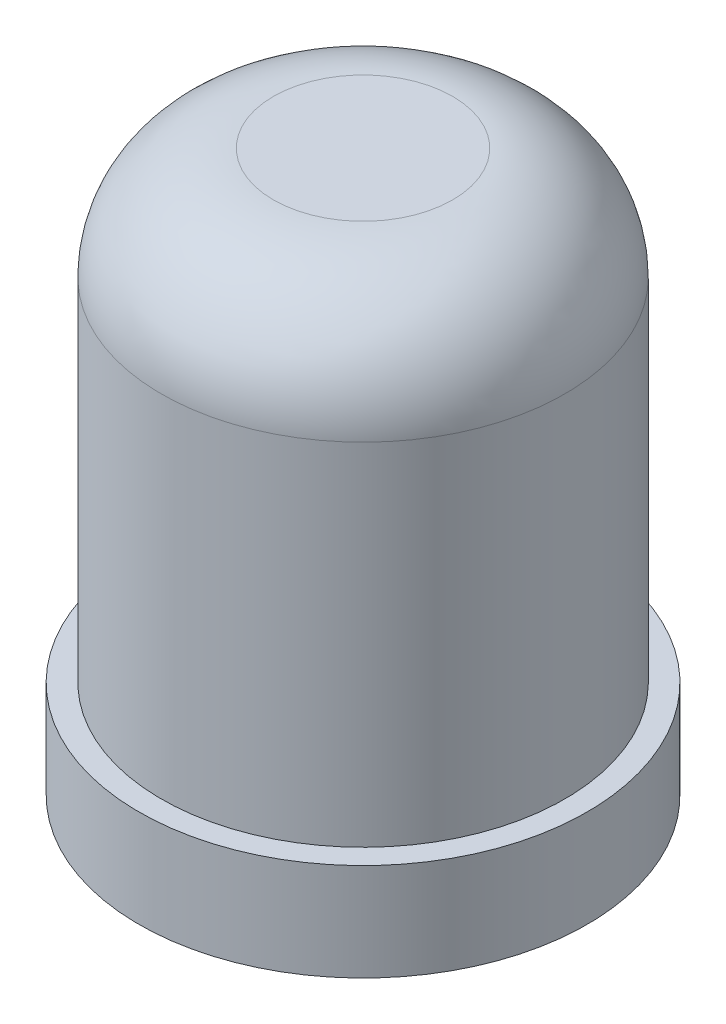
ISO-10303-21;
HEADER;
FILE_DESCRIPTION(('STEP AP214'),'2;1');
FILE_NAME('part.step','',(''),(''),'','','');
FILE_SCHEMA(('AUTOMOTIVE_DESIGN { 1 0 10303 214 1 1 1 1 }'));
ENDSEC;
DATA;
#1=APPLICATION_CONTEXT('core data for automotive mechanical design processes');
#2=APPLICATION_PROTOCOL_DEFINITION('international standard','automotive_design',2000,#1);
#3=PRODUCT_CONTEXT('',#1,'mechanical');
#4=PRODUCT('Part','Part','',(#3));
#5=PRODUCT_RELATED_PRODUCT_CATEGORY('part','',(#4));
#6=PRODUCT_DEFINITION_FORMATION('','',#4);
#7=PRODUCT_DEFINITION_CONTEXT('part definition',#1,'design');
#8=PRODUCT_DEFINITION('design','',#6,#7);
#9=PRODUCT_DEFINITION_SHAPE('','',#8);
#10=(LENGTH_UNIT() NAMED_UNIT(*) SI_UNIT(.MILLI.,.METRE.));
#11=(NAMED_UNIT(*) PLANE_ANGLE_UNIT() SI_UNIT($,.RADIAN.));
#12=(NAMED_UNIT(*) SI_UNIT($,.STERADIAN.) SOLID_ANGLE_UNIT());
#13=UNCERTAINTY_MEASURE_WITH_UNIT(LENGTH_MEASURE(1.E-05),#10,'distance_accuracy_value','');
#14=(GEOMETRIC_REPRESENTATION_CONTEXT(3) GLOBAL_UNCERTAINTY_ASSIGNED_CONTEXT((#13)) GLOBAL_UNIT_ASSIGNED_CONTEXT((#10,
#11,#12)) REPRESENTATION_CONTEXT('',''));
#15=CARTESIAN_POINT('',(0.,0.,0.));
#16=DIRECTION('',(0.,0.,1.));
#17=DIRECTION('',(1.,0.,0.));
#18=AXIS2_PLACEMENT_3D('',#15,#16,#17);
#19=CARTESIAN_POINT('',(4.,25.,0.));
#20=DIRECTION('',(0.,-1.,0.));
#21=DIRECTION('',(1.,0.,0.));
#22=AXIS2_PLACEMENT_3D('',#19,#20,#21);
#23=PLANE('',#22);
#24=CARTESIAN_POINT('',(0.,25.,0.));
#25=DIRECTION('',(0.,1.,0.));
#26=DIRECTION('',(-1.,0.,0.));
#27=AXIS2_PLACEMENT_3D('',#24,#25,#26);
#28=CIRCLE('',#27,4.);
#29=CARTESIAN_POINT('',(-4.,25.,0.));
#30=VERTEX_POINT('',#29);
#31=EDGE_CURVE('E10',#30,#30,#28,.T.);
#32=ORIENTED_EDGE('',*,*,#31,.T.);
#33=EDGE_LOOP('',(#32));
#34=FACE_BOUND('',#33,.T.);
#35=ADVANCED_FACE('F35',(#34),#23,.F.);
#36=CARTESIAN_POINT('',(0.,20.,0.));
#37=DIRECTION('',(0.,1.,0.));
#38=DIRECTION('',(-1.,0.,0.));
#39=AXIS2_PLACEMENT_3D('',#36,#37,#38);
#40=DEGENERATE_TOROIDAL_SURFACE('',#39,4.,5.,.T.);
#41=ORIENTED_EDGE('',*,*,#31,.F.);
#42=EDGE_LOOP('',(#41));
#43=FACE_BOUND('',#42,.T.);
#44=CARTESIAN_POINT('',(0.,20.,0.));
#45=DIRECTION('',(0.,1.,0.));
#46=DIRECTION('',(-1.,0.,0.));
#47=AXIS2_PLACEMENT_3D('',#44,#45,#46);
#48=CIRCLE('',#47,9.);
#49=CARTESIAN_POINT('',(-9.,20.,0.));
#50=VERTEX_POINT('',#49);
#51=EDGE_CURVE('E41',#50,#50,#48,.T.);
#52=ORIENTED_EDGE('',*,*,#51,.T.);
#53=EDGE_LOOP('',(#52));
#54=FACE_BOUND('',#53,.T.);
#55=ADVANCED_FACE('F70',(#43,#54),#40,.T.);
#56=CARTESIAN_POINT('',(0.,25.,0.));
#57=DIRECTION('',(0.,1.,0.));
#58=DIRECTION('',(-1.,0.,0.));
#59=AXIS2_PLACEMENT_3D('',#56,#57,#58);
#60=CYLINDRICAL_SURFACE('',#59,9.);
#61=ORIENTED_EDGE('',*,*,#51,.F.);
#62=EDGE_LOOP('',(#61));
#63=FACE_BOUND('',#62,.T.);
#64=CARTESIAN_POINT('',(0.,4.34657442294423,0.));
#65=DIRECTION('',(0.,1.,0.));
#66=DIRECTION('',(-1.,0.,0.));
#67=AXIS2_PLACEMENT_3D('',#64,#65,#66);
#68=CIRCLE('',#67,9.);
#69=CARTESIAN_POINT('',(-9.,4.34657442294423,0.));
#70=VERTEX_POINT('',#69);
#71=EDGE_CURVE('E45',#70,#70,#68,.T.);
#72=ORIENTED_EDGE('',*,*,#71,.T.);
#73=EDGE_LOOP('',(#72));
#74=FACE_BOUND('',#73,.T.);
#75=ADVANCED_FACE('F74',(#63,#74),#60,.T.);
#76=CARTESIAN_POINT('',(10.,4.34657442294423,0.));
#77=DIRECTION('',(0.,-1.,0.));
#78=DIRECTION('',(1.,0.,0.));
#79=AXIS2_PLACEMENT_3D('',#76,#77,#78);
#80=PLANE('',#79);
#81=ORIENTED_EDGE('',*,*,#71,.F.);
#82=EDGE_LOOP('',(#81));
#83=FACE_BOUND('',#82,.T.);
#84=CARTESIAN_POINT('',(0.,4.34657442294423,0.));
#85=DIRECTION('',(0.,1.,0.));
#86=DIRECTION('',(-1.,0.,0.));
#87=AXIS2_PLACEMENT_3D('',#84,#85,#86);
#88=CIRCLE('',#87,10.);
#89=CARTESIAN_POINT('',(-10.,4.34657442294423,0.));
#90=VERTEX_POINT('',#89);
#91=EDGE_CURVE('E49',#90,#90,#88,.T.);
#92=ORIENTED_EDGE('',*,*,#91,.T.);
#93=EDGE_LOOP('',(#92));
#94=FACE_BOUND('',#93,.T.);
#95=ADVANCED_FACE('F66',(#83,#94),#80,.F.);
#96=CARTESIAN_POINT('',(0.,25.,0.));
#97=DIRECTION('',(0.,1.,0.));
#98=DIRECTION('',(-1.,0.,0.));
#99=AXIS2_PLACEMENT_3D('',#96,#97,#98);
#100=CYLINDRICAL_SURFACE('',#99,10.);
#101=ORIENTED_EDGE('',*,*,#91,.F.);
#102=EDGE_LOOP('',(#101));
#103=FACE_BOUND('',#102,.T.);
#104=CARTESIAN_POINT('',(0.,0.,0.));
#105=DIRECTION('',(0.,1.,0.));
#106=DIRECTION('',(-1.,0.,0.));
#107=AXIS2_PLACEMENT_3D('',#104,#105,#106);
#108=CIRCLE('',#107,10.);
#109=CARTESIAN_POINT('',(-10.,0.,0.));
#110=VERTEX_POINT('',#109);
#111=EDGE_CURVE('E54',#110,#110,#108,.T.);
#112=ORIENTED_EDGE('',*,*,#111,.T.);
#113=EDGE_LOOP('',(#112));
#114=FACE_BOUND('',#113,.T.);
#115=ADVANCED_FACE('F58',(#103,#114),#100,.T.);
#116=CARTESIAN_POINT('',(0.,0.,0.));
#117=DIRECTION('',(0.,1.,0.));
#118=DIRECTION('',(-1.,0.,0.));
#119=AXIS2_PLACEMENT_3D('',#116,#117,#118);
#120=PLANE('',#119);
#121=ORIENTED_EDGE('',*,*,#111,.F.);
#122=EDGE_LOOP('',(#121));
#123=FACE_BOUND('',#122,.T.);
#124=ADVANCED_FACE('F60',(#123),#120,.F.);
#125=CLOSED_SHELL('',(#35,#55,#75,#95,#115,#124));
#126=MANIFOLD_SOLID_BREP('B2',#125);
#127=ADVANCED_BREP_SHAPE_REPRESENTATION('',(#18,#126),#14);
#128=SHAPE_DEFINITION_REPRESENTATION(#9,#127);
ENDSEC;
END-ISO-10303-21;
